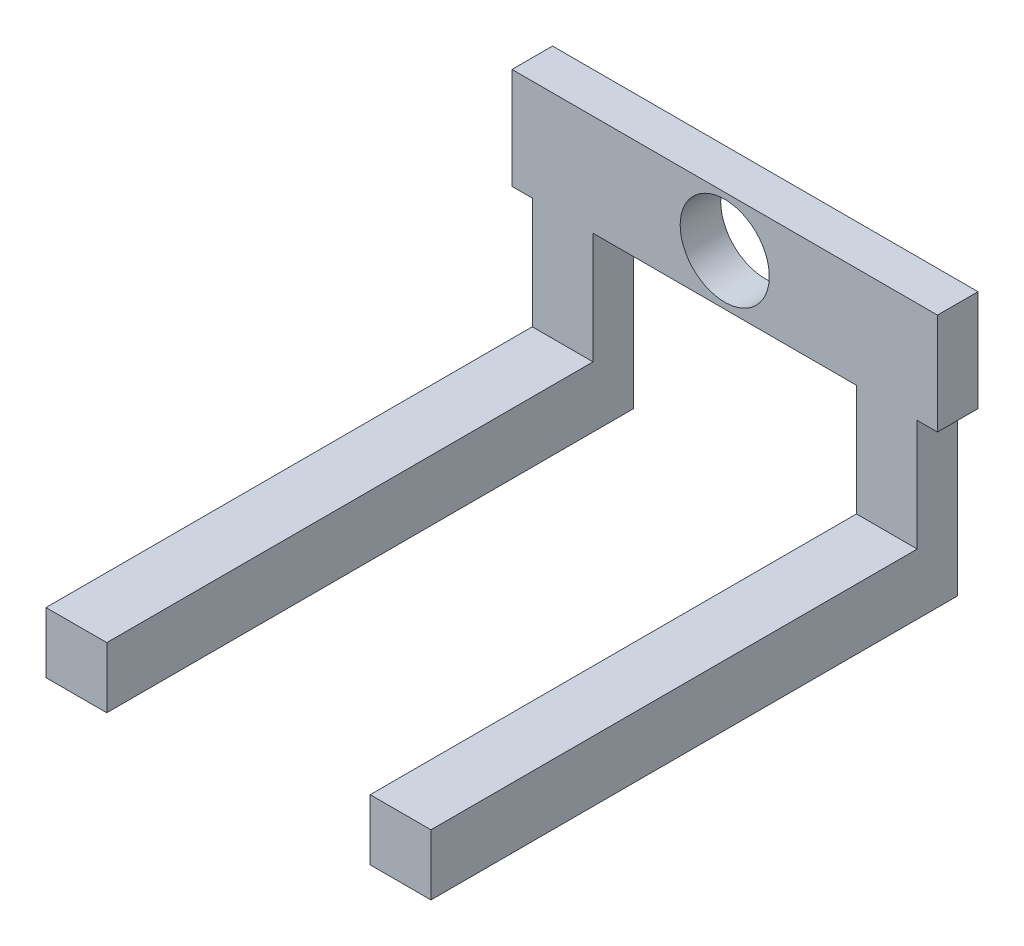
ISO-10303-21;
HEADER;
FILE_DESCRIPTION(('STEP AP214'),'2;1');
FILE_NAME('part.step','',(''),(''),'','','');
FILE_SCHEMA(('AUTOMOTIVE_DESIGN { 1 0 10303 214 1 1 1 1 }'));
ENDSEC;
DATA;
#1=APPLICATION_CONTEXT('core data for automotive mechanical design processes');
#2=APPLICATION_PROTOCOL_DEFINITION('international standard','automotive_design',2000,#1);
#3=PRODUCT_CONTEXT('',#1,'mechanical');
#4=PRODUCT('Part','Part','',(#3));
#5=PRODUCT_RELATED_PRODUCT_CATEGORY('part','',(#4));
#6=PRODUCT_DEFINITION_FORMATION('','',#4);
#7=PRODUCT_DEFINITION_CONTEXT('part definition',#1,'design');
#8=PRODUCT_DEFINITION('design','',#6,#7);
#9=PRODUCT_DEFINITION_SHAPE('','',#8);
#10=(LENGTH_UNIT() NAMED_UNIT(*) SI_UNIT(.MILLI.,.METRE.));
#11=(NAMED_UNIT(*) PLANE_ANGLE_UNIT() SI_UNIT($,.RADIAN.));
#12=(NAMED_UNIT(*) SI_UNIT($,.STERADIAN.) SOLID_ANGLE_UNIT());
#13=UNCERTAINTY_MEASURE_WITH_UNIT(LENGTH_MEASURE(1.E-05),#10,'distance_accuracy_value','');
#14=(GEOMETRIC_REPRESENTATION_CONTEXT(3) GLOBAL_UNCERTAINTY_ASSIGNED_CONTEXT((#13)) GLOBAL_UNIT_ASSIGNED_CONTEXT((#10,
#11,#12)) REPRESENTATION_CONTEXT('',''));
#15=CARTESIAN_POINT('',(0.,0.,0.));
#16=DIRECTION('',(0.,0.,1.));
#17=DIRECTION('',(1.,0.,0.));
#18=AXIS2_PLACEMENT_3D('',#15,#16,#17);
#19=CARTESIAN_POINT('',(0.,15.,125.));
#20=DIRECTION('',(0.,-1.,0.));
#21=DIRECTION('',(0.,0.,-1.));
#22=AXIS2_PLACEMENT_3D('',#19,#20,#21);
#23=PLANE('',#22);
#24=DIRECTION('',(1.,0.,0.));
#25=VECTOR('',#24,1.);
#26=CARTESIAN_POINT('',(0.,15.,5.));
#27=LINE('',#26,#25);
#28=CARTESIAN_POINT('',(0.,15.,5.));
#29=VERTEX_POINT('',#28);
#30=CARTESIAN_POINT('',(15.,15.,5.));
#31=VERTEX_POINT('',#30);
#32=EDGE_CURVE('E11',#29,#31,#27,.T.);
#33=ORIENTED_EDGE('',*,*,#32,.F.);
#34=DIRECTION('',(0.,0.,-1.));
#35=VECTOR('',#34,1.);
#36=CARTESIAN_POINT('',(0.,15.,125.));
#37=LINE('',#36,#35);
#38=CARTESIAN_POINT('',(0.,15.,125.));
#39=VERTEX_POINT('',#38);
#40=EDGE_CURVE('E318',#39,#29,#37,.T.);
#41=ORIENTED_EDGE('',*,*,#40,.F.);
#42=DIRECTION('',(-1.,0.,0.));
#43=VECTOR('',#42,1.);
#44=CARTESIAN_POINT('',(0.,15.,125.));
#45=LINE('',#44,#43);
#46=CARTESIAN_POINT('',(15.,15.,125.));
#47=VERTEX_POINT('',#46);
#48=EDGE_CURVE('E57',#47,#39,#45,.T.);
#49=ORIENTED_EDGE('',*,*,#48,.F.);
#50=DIRECTION('',(0.,0.,-1.));
#51=VECTOR('',#50,1.);
#52=CARTESIAN_POINT('',(15.,15.,125.));
#53=LINE('',#52,#51);
#54=EDGE_CURVE('E322',#47,#31,#53,.T.);
#55=ORIENTED_EDGE('',*,*,#54,.T.);
#56=EDGE_LOOP('',(#33,#41,#49,#55));
#57=FACE_BOUND('',#56,.T.);
#58=ADVANCED_FACE('F41',(#57),#23,.F.);
#59=CARTESIAN_POINT('',(0.,0.,125.));
#60=DIRECTION('',(1.,0.,0.));
#61=DIRECTION('',(0.,0.,-1.));
#62=AXIS2_PLACEMENT_3D('',#59,#60,#61);
#63=PLANE('',#62);
#64=DIRECTION('',(0.,1.,0.));
#65=VECTOR('',#64,1.);
#66=CARTESIAN_POINT('',(0.,0.,-5.));
#67=LINE('',#66,#65);
#68=CARTESIAN_POINT('',(0.,0.,-5.));
#69=VERTEX_POINT('',#68);
#70=CARTESIAN_POINT('',(0.,42.5,-5.));
#71=VERTEX_POINT('',#70);
#72=EDGE_CURVE('E177',#69,#71,#67,.T.);
#73=ORIENTED_EDGE('',*,*,#72,.F.);
#74=DIRECTION('',(0.,0.,-1.));
#75=VECTOR('',#74,1.);
#76=CARTESIAN_POINT('',(0.,0.,125.));
#77=LINE('',#76,#75);
#78=CARTESIAN_POINT('',(0.,0.,125.));
#79=VERTEX_POINT('',#78);
#80=EDGE_CURVE('E50',#79,#69,#77,.T.);
#81=ORIENTED_EDGE('',*,*,#80,.F.);
#82=DIRECTION('',(0.,-1.,0.));
#83=VECTOR('',#82,1.);
#84=CARTESIAN_POINT('',(0.,0.,125.));
#85=LINE('',#84,#83);
#86=EDGE_CURVE('E288',#39,#79,#85,.T.);
#87=ORIENTED_EDGE('',*,*,#86,.F.);
#88=ORIENTED_EDGE('',*,*,#40,.T.);
#89=DIRECTION('',(0.,1.,0.));
#90=VECTOR('',#89,1.);
#91=CARTESIAN_POINT('',(0.,0.,5.));
#92=LINE('',#91,#90);
#93=CARTESIAN_POINT('',(0.,42.5,5.));
#94=VERTEX_POINT('',#93);
#95=EDGE_CURVE('E214',#29,#94,#92,.T.);
#96=ORIENTED_EDGE('',*,*,#95,.T.);
#97=DIRECTION('',(0.,0.,-1.));
#98=VECTOR('',#97,1.);
#99=CARTESIAN_POINT('',(0.,42.5,5.));
#100=LINE('',#99,#98);
#101=EDGE_CURVE('E253',#94,#71,#100,.T.);
#102=ORIENTED_EDGE('',*,*,#101,.T.);
#103=EDGE_LOOP('',(#73,#81,#87,#88,#96,#102));
#104=FACE_BOUND('',#103,.T.);
#105=ADVANCED_FACE('F43',(#104),#63,.F.);
#106=CARTESIAN_POINT('',(0.,0.,125.));
#107=DIRECTION('',(0.,1.,0.));
#108=DIRECTION('',(0.,0.,1.));
#109=AXIS2_PLACEMENT_3D('',#106,#107,#108);
#110=PLANE('',#109);
#111=DIRECTION('',(-1.,0.,0.));
#112=VECTOR('',#111,1.);
#113=CARTESIAN_POINT('',(0.,0.,-5.));
#114=LINE('',#113,#112);
#115=CARTESIAN_POINT('',(15.,0.,-5.));
#116=VERTEX_POINT('',#115);
#117=EDGE_CURVE('E218',#116,#69,#114,.T.);
#118=ORIENTED_EDGE('',*,*,#117,.F.);
#119=DIRECTION('',(0.,0.,-1.));
#120=VECTOR('',#119,1.);
#121=CARTESIAN_POINT('',(15.,0.,125.));
#122=LINE('',#121,#120);
#123=CARTESIAN_POINT('',(15.,0.,125.));
#124=VERTEX_POINT('',#123);
#125=EDGE_CURVE('E326',#124,#116,#122,.T.);
#126=ORIENTED_EDGE('',*,*,#125,.F.);
#127=DIRECTION('',(1.,0.,0.));
#128=VECTOR('',#127,1.);
#129=CARTESIAN_POINT('',(0.,0.,125.));
#130=LINE('',#129,#128);
#131=EDGE_CURVE('E311',#79,#124,#130,.T.);
#132=ORIENTED_EDGE('',*,*,#131,.F.);
#133=ORIENTED_EDGE('',*,*,#80,.T.);
#134=EDGE_LOOP('',(#118,#126,#132,#133));
#135=FACE_BOUND('',#134,.T.);
#136=ADVANCED_FACE('F333',(#135),#110,.F.);
#137=CARTESIAN_POINT('',(15.,0.,125.));
#138=DIRECTION('',(-1.,0.,0.));
#139=DIRECTION('',(0.,0.,1.));
#140=AXIS2_PLACEMENT_3D('',#137,#138,#139);
#141=PLANE('',#140);
#142=DIRECTION('',(0.,1.,0.));
#143=VECTOR('',#142,1.);
#144=CARTESIAN_POINT('',(15.,0.,5.));
#145=LINE('',#144,#143);
#146=CARTESIAN_POINT('',(15.,42.5,5.));
#147=VERTEX_POINT('',#146);
#148=EDGE_CURVE('E250',#31,#147,#145,.T.);
#149=ORIENTED_EDGE('',*,*,#148,.F.);
#150=ORIENTED_EDGE('',*,*,#54,.F.);
#151=DIRECTION('',(0.,1.,0.));
#152=VECTOR('',#151,1.);
#153=CARTESIAN_POINT('',(15.,0.,125.));
#154=LINE('',#153,#152);
#155=EDGE_CURVE('E62',#124,#47,#154,.T.);
#156=ORIENTED_EDGE('',*,*,#155,.F.);
#157=ORIENTED_EDGE('',*,*,#125,.T.);
#158=DIRECTION('',(0.,1.,0.));
#159=VECTOR('',#158,1.);
#160=CARTESIAN_POINT('',(15.,0.,-5.));
#161=LINE('',#160,#159);
#162=CARTESIAN_POINT('',(15.,42.5,-5.));
#163=VERTEX_POINT('',#162);
#164=EDGE_CURVE('E278',#116,#163,#161,.T.);
#165=ORIENTED_EDGE('',*,*,#164,.T.);
#166=DIRECTION('',(0.,0.,-1.));
#167=VECTOR('',#166,1.);
#168=CARTESIAN_POINT('',(15.,42.5,5.));
#169=LINE('',#168,#167);
#170=EDGE_CURVE('E285',#147,#163,#169,.T.);
#171=ORIENTED_EDGE('',*,*,#170,.F.);
#172=EDGE_LOOP('',(#149,#150,#156,#157,#165,#171));
#173=FACE_BOUND('',#172,.T.);
#174=ADVANCED_FACE('F343',(#173),#141,.F.);
#175=CARTESIAN_POINT('',(0.,0.,125.));
#176=DIRECTION('',(0.,0.,-1.));
#177=DIRECTION('',(-1.,0.,0.));
#178=AXIS2_PLACEMENT_3D('',#175,#176,#177);
#179=PLANE('',#178);
#180=ORIENTED_EDGE('',*,*,#86,.T.);
#181=ORIENTED_EDGE('',*,*,#131,.T.);
#182=ORIENTED_EDGE('',*,*,#155,.T.);
#183=ORIENTED_EDGE('',*,*,#48,.T.);
#184=EDGE_LOOP('',(#180,#181,#182,#183));
#185=FACE_BOUND('',#184,.T.);
#186=ADVANCED_FACE('F346',(#185),#179,.F.);
#187=CARTESIAN_POINT('',(0.,0.,5.));
#188=DIRECTION('',(0.,0.,-1.));
#189=DIRECTION('',(-1.,0.,0.));
#190=AXIS2_PLACEMENT_3D('',#187,#188,#189);
#191=PLANE('',#190);
#192=CARTESIAN_POINT('',(47.5,55.,5.));
#193=DIRECTION('',(0.,0.,-1.));
#194=DIRECTION('',(-1.,0.,0.));
#195=AXIS2_PLACEMENT_3D('',#192,#193,#194);
#196=CIRCLE('',#195,11.);
#197=CARTESIAN_POINT('',(36.5,55.,5.));
#198=VERTEX_POINT('',#197);
#199=EDGE_CURVE('E187',#198,#198,#196,.T.);
#200=ORIENTED_EDGE('',*,*,#199,.T.);
#201=EDGE_LOOP('',(#200));
#202=FACE_BOUND('',#201,.T.);
#203=ORIENTED_EDGE('',*,*,#95,.F.);
#204=ORIENTED_EDGE('',*,*,#32,.T.);
#205=ORIENTED_EDGE('',*,*,#148,.T.);
#206=DIRECTION('',(-1.,0.,0.));
#207=VECTOR('',#206,1.);
#208=CARTESIAN_POINT('',(0.,42.5,5.));
#209=LINE('',#208,#207);
#210=CARTESIAN_POINT('',(80.,42.5,5.));
#211=VERTEX_POINT('',#210);
#212=EDGE_CURVE('E246',#211,#147,#209,.T.);
#213=ORIENTED_EDGE('',*,*,#212,.F.);
#214=DIRECTION('',(0.,1.,0.));
#215=VECTOR('',#214,1.);
#216=CARTESIAN_POINT('',(80.,0.,5.));
#217=LINE('',#216,#215);
#218=CARTESIAN_POINT('',(80.,15.,5.));
#219=VERTEX_POINT('',#218);
#220=EDGE_CURVE('E243',#219,#211,#217,.T.);
#221=ORIENTED_EDGE('',*,*,#220,.F.);
#222=DIRECTION('',(1.,0.,0.));
#223=VECTOR('',#222,1.);
#224=CARTESIAN_POINT('',(0.,15.,5.));
#225=LINE('',#224,#223);
#226=CARTESIAN_POINT('',(95.,15.,5.));
#227=VERTEX_POINT('',#226);
#228=EDGE_CURVE('E239',#219,#227,#225,.T.);
#229=ORIENTED_EDGE('',*,*,#228,.T.);
#230=DIRECTION('',(0.,1.,0.));
#231=VECTOR('',#230,1.);
#232=CARTESIAN_POINT('',(95.,0.,5.));
#233=LINE('',#232,#231);
#234=CARTESIAN_POINT('',(95.,42.5,5.));
#235=VERTEX_POINT('',#234);
#236=EDGE_CURVE('E236',#227,#235,#233,.T.);
#237=ORIENTED_EDGE('',*,*,#236,.T.);
#238=DIRECTION('',(-1.,0.,0.));
#239=VECTOR('',#238,1.);
#240=CARTESIAN_POINT('',(0.,42.5,5.));
#241=LINE('',#240,#239);
#242=CARTESIAN_POINT('',(100.,42.5,5.));
#243=VERTEX_POINT('',#242);
#244=EDGE_CURVE('E232',#243,#235,#241,.T.);
#245=ORIENTED_EDGE('',*,*,#244,.F.);
#246=DIRECTION('',(0.,-1.,0.));
#247=VECTOR('',#246,1.);
#248=CARTESIAN_POINT('',(100.,0.,5.));
#249=LINE('',#248,#247);
#250=CARTESIAN_POINT('',(100.,67.5,5.));
#251=VERTEX_POINT('',#250);
#252=EDGE_CURVE('E228',#251,#243,#249,.T.);
#253=ORIENTED_EDGE('',*,*,#252,.F.);
#254=DIRECTION('',(-1.,0.,0.));
#255=VECTOR('',#254,1.);
#256=CARTESIAN_POINT('',(0.,67.5,5.));
#257=LINE('',#256,#255);
#258=CARTESIAN_POINT('',(-5.,67.5,5.));
#259=VERTEX_POINT('',#258);
#260=EDGE_CURVE('E225',#251,#259,#257,.T.);
#261=ORIENTED_EDGE('',*,*,#260,.T.);
#262=DIRECTION('',(0.,-1.,0.));
#263=VECTOR('',#262,1.);
#264=CARTESIAN_POINT('',(-5.,0.,5.));
#265=LINE('',#264,#263);
#266=CARTESIAN_POINT('',(-5.,42.5,5.));
#267=VERTEX_POINT('',#266);
#268=EDGE_CURVE('E222',#259,#267,#265,.T.);
#269=ORIENTED_EDGE('',*,*,#268,.T.);
#270=DIRECTION('',(-1.,0.,0.));
#271=VECTOR('',#270,1.);
#272=CARTESIAN_POINT('',(0.,42.5,5.));
#273=LINE('',#272,#271);
#274=EDGE_CURVE('E217',#94,#267,#273,.T.);
#275=ORIENTED_EDGE('',*,*,#274,.F.);
#276=EDGE_LOOP('',(#203,#204,#205,#213,#221,#229,#237,#245,#253,#261,#269,#275));
#277=FACE_BOUND('',#276,.T.);
#278=ADVANCED_FACE('F348',(#202,#277),#191,.F.);
#279=CARTESIAN_POINT('',(0.,42.5,5.));
#280=DIRECTION('',(0.,-1.,0.));
#281=DIRECTION('',(0.,0.,-1.));
#282=AXIS2_PLACEMENT_3D('',#279,#280,#281);
#283=PLANE('',#282);
#284=DIRECTION('',(-1.,0.,0.));
#285=VECTOR('',#284,1.);
#286=CARTESIAN_POINT('',(0.,42.5,-5.));
#287=LINE('',#286,#285);
#288=CARTESIAN_POINT('',(80.,42.5,-5.));
#289=VERTEX_POINT('',#288);
#290=EDGE_CURVE('E166',#289,#163,#287,.T.);
#291=ORIENTED_EDGE('',*,*,#290,.F.);
#292=DIRECTION('',(0.,0.,-1.));
#293=VECTOR('',#292,1.);
#294=CARTESIAN_POINT('',(80.,42.5,5.));
#295=LINE('',#294,#293);
#296=EDGE_CURVE('E160',#211,#289,#295,.T.);
#297=ORIENTED_EDGE('',*,*,#296,.F.);
#298=ORIENTED_EDGE('',*,*,#212,.T.);
#299=ORIENTED_EDGE('',*,*,#170,.T.);
#300=EDGE_LOOP('',(#291,#297,#298,#299));
#301=FACE_BOUND('',#300,.T.);
#302=ADVANCED_FACE('F354',(#301),#283,.T.);
#303=CARTESIAN_POINT('',(80.,0.,5.));
#304=DIRECTION('',(-1.,0.,0.));
#305=DIRECTION('',(0.,0.,1.));
#306=AXIS2_PLACEMENT_3D('',#303,#304,#305);
#307=PLANE('',#306);
#308=DIRECTION('',(0.,1.,0.));
#309=VECTOR('',#308,1.);
#310=CARTESIAN_POINT('',(80.,0.,-5.));
#311=LINE('',#310,#309);
#312=CARTESIAN_POINT('',(80.,0.,-5.));
#313=VERTEX_POINT('',#312);
#314=EDGE_CURVE('E154',#313,#289,#311,.T.);
#315=ORIENTED_EDGE('',*,*,#314,.F.);
#316=DIRECTION('',(0.,0.,-1.));
#317=VECTOR('',#316,1.);
#318=CARTESIAN_POINT('',(80.,0.,125.));
#319=LINE('',#318,#317);
#320=CARTESIAN_POINT('',(80.,0.,125.));
#321=VERTEX_POINT('',#320);
#322=EDGE_CURVE('E158',#321,#313,#319,.T.);
#323=ORIENTED_EDGE('',*,*,#322,.F.);
#324=DIRECTION('',(0.,-1.,0.));
#325=VECTOR('',#324,1.);
#326=CARTESIAN_POINT('',(80.,0.,125.));
#327=LINE('',#326,#325);
#328=CARTESIAN_POINT('',(80.,15.,125.));
#329=VERTEX_POINT('',#328);
#330=EDGE_CURVE('E186',#329,#321,#327,.T.);
#331=ORIENTED_EDGE('',*,*,#330,.F.);
#332=DIRECTION('',(0.,0.,-1.));
#333=VECTOR('',#332,1.);
#334=CARTESIAN_POINT('',(80.,15.,125.));
#335=LINE('',#334,#333);
#336=EDGE_CURVE('E205',#329,#219,#335,.T.);
#337=ORIENTED_EDGE('',*,*,#336,.T.);
#338=ORIENTED_EDGE('',*,*,#220,.T.);
#339=ORIENTED_EDGE('',*,*,#296,.T.);
#340=EDGE_LOOP('',(#315,#323,#331,#337,#338,#339));
#341=FACE_BOUND('',#340,.T.);
#342=ADVANCED_FACE('F156',(#341),#307,.T.);
#343=CARTESIAN_POINT('',(95.,0.,5.));
#344=DIRECTION('',(-1.,0.,0.));
#345=DIRECTION('',(0.,0.,1.));
#346=AXIS2_PLACEMENT_3D('',#343,#344,#345);
#347=PLANE('',#346);
#348=DIRECTION('',(0.,0.,-1.));
#349=VECTOR('',#348,1.);
#350=CARTESIAN_POINT('',(95.,0.,125.));
#351=LINE('',#350,#349);
#352=CARTESIAN_POINT('',(95.,0.,125.));
#353=VERTEX_POINT('',#352);
#354=CARTESIAN_POINT('',(95.,0.,-5.));
#355=VERTEX_POINT('',#354);
#356=EDGE_CURVE('E178',#353,#355,#351,.T.);
#357=ORIENTED_EDGE('',*,*,#356,.T.);
#358=DIRECTION('',(0.,1.,0.));
#359=VECTOR('',#358,1.);
#360=CARTESIAN_POINT('',(95.,0.,-5.));
#361=LINE('',#360,#359);
#362=CARTESIAN_POINT('',(95.,42.5,-5.));
#363=VERTEX_POINT('',#362);
#364=EDGE_CURVE('E167',#355,#363,#361,.T.);
#365=ORIENTED_EDGE('',*,*,#364,.T.);
#366=DIRECTION('',(0.,0.,-1.));
#367=VECTOR('',#366,1.);
#368=CARTESIAN_POINT('',(95.,42.5,5.));
#369=LINE('',#368,#367);
#370=EDGE_CURVE('E291',#235,#363,#369,.T.);
#371=ORIENTED_EDGE('',*,*,#370,.F.);
#372=ORIENTED_EDGE('',*,*,#236,.F.);
#373=DIRECTION('',(0.,0.,-1.));
#374=VECTOR('',#373,1.);
#375=CARTESIAN_POINT('',(95.,15.,125.));
#376=LINE('',#375,#374);
#377=CARTESIAN_POINT('',(95.,15.,125.));
#378=VERTEX_POINT('',#377);
#379=EDGE_CURVE('E209',#378,#227,#376,.T.);
#380=ORIENTED_EDGE('',*,*,#379,.F.);
#381=DIRECTION('',(0.,1.,0.));
#382=VECTOR('',#381,1.);
#383=CARTESIAN_POINT('',(95.,0.,125.));
#384=LINE('',#383,#382);
#385=EDGE_CURVE('E199',#353,#378,#384,.T.);
#386=ORIENTED_EDGE('',*,*,#385,.F.);
#387=EDGE_LOOP('',(#357,#365,#371,#372,#380,#386));
#388=FACE_BOUND('',#387,.T.);
#389=ADVANCED_FACE('F397',(#388),#347,.F.);
#390=CARTESIAN_POINT('',(0.,42.5,5.));
#391=DIRECTION('',(0.,-1.,0.));
#392=DIRECTION('',(0.,0.,-1.));
#393=AXIS2_PLACEMENT_3D('',#390,#391,#392);
#394=PLANE('',#393);
#395=DIRECTION('',(-1.,0.,0.));
#396=VECTOR('',#395,1.);
#397=CARTESIAN_POINT('',(0.,42.5,-5.));
#398=LINE('',#397,#396);
#399=CARTESIAN_POINT('',(100.,42.5,-5.));
#400=VERTEX_POINT('',#399);
#401=EDGE_CURVE('E271',#400,#363,#398,.T.);
#402=ORIENTED_EDGE('',*,*,#401,.F.);
#403=DIRECTION('',(0.,0.,-1.));
#404=VECTOR('',#403,1.);
#405=CARTESIAN_POINT('',(100.,42.5,5.));
#406=LINE('',#405,#404);
#407=EDGE_CURVE('E294',#243,#400,#406,.T.);
#408=ORIENTED_EDGE('',*,*,#407,.F.);
#409=ORIENTED_EDGE('',*,*,#244,.T.);
#410=ORIENTED_EDGE('',*,*,#370,.T.);
#411=EDGE_LOOP('',(#402,#408,#409,#410));
#412=FACE_BOUND('',#411,.T.);
#413=ADVANCED_FACE('F391',(#412),#394,.T.);
#414=CARTESIAN_POINT('',(100.,0.,5.));
#415=DIRECTION('',(1.,0.,0.));
#416=DIRECTION('',(0.,0.,-1.));
#417=AXIS2_PLACEMENT_3D('',#414,#415,#416);
#418=PLANE('',#417);
#419=DIRECTION('',(0.,-1.,0.));
#420=VECTOR('',#419,1.);
#421=CARTESIAN_POINT('',(100.,0.,-5.));
#422=LINE('',#421,#420);
#423=CARTESIAN_POINT('',(100.,67.5,-5.));
#424=VERTEX_POINT('',#423);
#425=EDGE_CURVE('E267',#424,#400,#422,.T.);
#426=ORIENTED_EDGE('',*,*,#425,.F.);
#427=DIRECTION('',(0.,0.,-1.));
#428=VECTOR('',#427,1.);
#429=CARTESIAN_POINT('',(100.,67.5,5.));
#430=LINE('',#429,#428);
#431=EDGE_CURVE('E297',#251,#424,#430,.T.);
#432=ORIENTED_EDGE('',*,*,#431,.F.);
#433=ORIENTED_EDGE('',*,*,#252,.T.);
#434=ORIENTED_EDGE('',*,*,#407,.T.);
#435=EDGE_LOOP('',(#426,#432,#433,#434));
#436=FACE_BOUND('',#435,.T.);
#437=ADVANCED_FACE('F396',(#436),#418,.T.);
#438=CARTESIAN_POINT('',(0.,67.5,5.));
#439=DIRECTION('',(0.,-1.,0.));
#440=DIRECTION('',(0.,0.,-1.));
#441=AXIS2_PLACEMENT_3D('',#438,#439,#440);
#442=PLANE('',#441);
#443=DIRECTION('',(-1.,0.,0.));
#444=VECTOR('',#443,1.);
#445=CARTESIAN_POINT('',(0.,67.5,-5.));
#446=LINE('',#445,#444);
#447=CARTESIAN_POINT('',(-5.,67.5,-5.));
#448=VERTEX_POINT('',#447);
#449=EDGE_CURVE('E264',#424,#448,#446,.T.);
#450=ORIENTED_EDGE('',*,*,#449,.T.);
#451=DIRECTION('',(0.,0.,-1.));
#452=VECTOR('',#451,1.);
#453=CARTESIAN_POINT('',(-5.,67.5,5.));
#454=LINE('',#453,#452);
#455=EDGE_CURVE('E300',#259,#448,#454,.T.);
#456=ORIENTED_EDGE('',*,*,#455,.F.);
#457=ORIENTED_EDGE('',*,*,#260,.F.);
#458=ORIENTED_EDGE('',*,*,#431,.T.);
#459=EDGE_LOOP('',(#450,#456,#457,#458));
#460=FACE_BOUND('',#459,.T.);
#461=ADVANCED_FACE('F409',(#460),#442,.F.);
#462=CARTESIAN_POINT('',(-5.,0.,5.));
#463=DIRECTION('',(1.,0.,0.));
#464=DIRECTION('',(0.,0.,-1.));
#465=AXIS2_PLACEMENT_3D('',#462,#463,#464);
#466=PLANE('',#465);
#467=DIRECTION('',(0.,-1.,0.));
#468=VECTOR('',#467,1.);
#469=CARTESIAN_POINT('',(-5.,0.,-5.));
#470=LINE('',#469,#468);
#471=CARTESIAN_POINT('',(-5.,42.5,-5.));
#472=VERTEX_POINT('',#471);
#473=EDGE_CURVE('E260',#448,#472,#470,.T.);
#474=ORIENTED_EDGE('',*,*,#473,.T.);
#475=DIRECTION('',(0.,0.,-1.));
#476=VECTOR('',#475,1.);
#477=CARTESIAN_POINT('',(-5.,42.5,5.));
#478=LINE('',#477,#476);
#479=EDGE_CURVE('E304',#267,#472,#478,.T.);
#480=ORIENTED_EDGE('',*,*,#479,.F.);
#481=ORIENTED_EDGE('',*,*,#268,.F.);
#482=ORIENTED_EDGE('',*,*,#455,.T.);
#483=EDGE_LOOP('',(#474,#480,#481,#482));
#484=FACE_BOUND('',#483,.T.);
#485=ADVANCED_FACE('F420',(#484),#466,.F.);
#486=CARTESIAN_POINT('',(0.,42.5,5.));
#487=DIRECTION('',(0.,-1.,0.));
#488=DIRECTION('',(0.,0.,-1.));
#489=AXIS2_PLACEMENT_3D('',#486,#487,#488);
#490=PLANE('',#489);
#491=DIRECTION('',(-1.,0.,0.));
#492=VECTOR('',#491,1.);
#493=CARTESIAN_POINT('',(0.,42.5,-5.));
#494=LINE('',#493,#492);
#495=EDGE_CURVE('E256',#71,#472,#494,.T.);
#496=ORIENTED_EDGE('',*,*,#495,.F.);
#497=ORIENTED_EDGE('',*,*,#101,.F.);
#498=ORIENTED_EDGE('',*,*,#274,.T.);
#499=ORIENTED_EDGE('',*,*,#479,.T.);
#500=EDGE_LOOP('',(#496,#497,#498,#499));
#501=FACE_BOUND('',#500,.T.);
#502=ADVANCED_FACE('F431',(#501),#490,.T.);
#503=CARTESIAN_POINT('',(0.,0.,-5.));
#504=DIRECTION('',(0.,0.,-1.));
#505=DIRECTION('',(-1.,0.,0.));
#506=AXIS2_PLACEMENT_3D('',#503,#504,#505);
#507=PLANE('',#506);
#508=CARTESIAN_POINT('',(47.5,55.,-5.));
#509=DIRECTION('',(0.,0.,-1.));
#510=DIRECTION('',(-1.,0.,0.));
#511=AXIS2_PLACEMENT_3D('',#508,#509,#510);
#512=CIRCLE('',#511,11.);
#513=CARTESIAN_POINT('',(36.5,55.,-5.));
#514=VERTEX_POINT('',#513);
#515=EDGE_CURVE('E193',#514,#514,#512,.T.);
#516=ORIENTED_EDGE('',*,*,#515,.F.);
#517=EDGE_LOOP('',(#516));
#518=FACE_BOUND('',#517,.T.);
#519=ORIENTED_EDGE('',*,*,#72,.T.);
#520=ORIENTED_EDGE('',*,*,#495,.T.);
#521=ORIENTED_EDGE('',*,*,#473,.F.);
#522=ORIENTED_EDGE('',*,*,#449,.F.);
#523=ORIENTED_EDGE('',*,*,#425,.T.);
#524=ORIENTED_EDGE('',*,*,#401,.T.);
#525=ORIENTED_EDGE('',*,*,#364,.F.);
#526=DIRECTION('',(-1.,0.,0.));
#527=VECTOR('',#526,1.);
#528=CARTESIAN_POINT('',(95.,0.,-5.));
#529=LINE('',#528,#527);
#530=EDGE_CURVE('E173',#355,#313,#529,.T.);
#531=ORIENTED_EDGE('',*,*,#530,.T.);
#532=ORIENTED_EDGE('',*,*,#314,.T.);
#533=ORIENTED_EDGE('',*,*,#290,.T.);
#534=ORIENTED_EDGE('',*,*,#164,.F.);
#535=ORIENTED_EDGE('',*,*,#117,.T.);
#536=EDGE_LOOP('',(#519,#520,#521,#522,#523,#524,#525,#531,#532,#533,#534,#535));
#537=FACE_BOUND('',#536,.T.);
#538=ADVANCED_FACE('F181',(#518,#537),#507,.T.);
#539=CARTESIAN_POINT('',(80.,15.,125.));
#540=DIRECTION('',(0.,-1.,0.));
#541=DIRECTION('',(0.,0.,-1.));
#542=AXIS2_PLACEMENT_3D('',#539,#540,#541);
#543=PLANE('',#542);
#544=ORIENTED_EDGE('',*,*,#379,.T.);
#545=ORIENTED_EDGE('',*,*,#228,.F.);
#546=ORIENTED_EDGE('',*,*,#336,.F.);
#547=DIRECTION('',(-1.,0.,0.));
#548=VECTOR('',#547,1.);
#549=CARTESIAN_POINT('',(80.,15.,125.));
#550=LINE('',#549,#548);
#551=EDGE_CURVE('E202',#378,#329,#550,.T.);
#552=ORIENTED_EDGE('',*,*,#551,.F.);
#553=EDGE_LOOP('',(#544,#545,#546,#552));
#554=FACE_BOUND('',#553,.T.);
#555=ADVANCED_FACE('F447',(#554),#543,.F.);
#556=CARTESIAN_POINT('',(80.,0.,125.));
#557=DIRECTION('',(0.,1.,0.));
#558=DIRECTION('',(0.,0.,1.));
#559=AXIS2_PLACEMENT_3D('',#556,#557,#558);
#560=PLANE('',#559);
#561=ORIENTED_EDGE('',*,*,#322,.T.);
#562=ORIENTED_EDGE('',*,*,#530,.F.);
#563=ORIENTED_EDGE('',*,*,#356,.F.);
#564=DIRECTION('',(1.,0.,0.));
#565=VECTOR('',#564,1.);
#566=CARTESIAN_POINT('',(80.,0.,125.));
#567=LINE('',#566,#565);
#568=EDGE_CURVE('E174',#321,#353,#567,.T.);
#569=ORIENTED_EDGE('',*,*,#568,.F.);
#570=EDGE_LOOP('',(#561,#562,#563,#569));
#571=FACE_BOUND('',#570,.T.);
#572=ADVANCED_FACE('F171',(#571),#560,.F.);
#573=CARTESIAN_POINT('',(0.,0.,125.));
#574=DIRECTION('',(0.,0.,-1.));
#575=DIRECTION('',(-1.,0.,0.));
#576=AXIS2_PLACEMENT_3D('',#573,#574,#575);
#577=PLANE('',#576);
#578=ORIENTED_EDGE('',*,*,#330,.T.);
#579=ORIENTED_EDGE('',*,*,#568,.T.);
#580=ORIENTED_EDGE('',*,*,#385,.T.);
#581=ORIENTED_EDGE('',*,*,#551,.T.);
#582=EDGE_LOOP('',(#578,#579,#580,#581));
#583=FACE_BOUND('',#582,.T.);
#584=ADVANCED_FACE('F460',(#583),#577,.F.);
#585=CARTESIAN_POINT('',(47.5,55.,48.));
#586=DIRECTION('',(0.,0.,-1.));
#587=DIRECTION('',(-1.,0.,0.));
#588=AXIS2_PLACEMENT_3D('',#585,#586,#587);
#589=CYLINDRICAL_SURFACE('',#588,11.);
#590=ORIENTED_EDGE('',*,*,#515,.T.);
#591=EDGE_LOOP('',(#590));
#592=FACE_BOUND('',#591,.T.);
#593=ORIENTED_EDGE('',*,*,#199,.F.);
#594=EDGE_LOOP('',(#593));
#595=FACE_BOUND('',#594,.T.);
#596=ADVANCED_FACE('F465',(#592,#595),#589,.F.);
#597=CLOSED_SHELL('',(#58,#105,#136,#174,#186,#278,#302,#342,#389,#413,#437,#461,#485,#502,#538,
#555,#572,#584,#596));
#598=MANIFOLD_SOLID_BREP('B2',#597);
#599=ADVANCED_BREP_SHAPE_REPRESENTATION('',(#18,#598),#14);
#600=SHAPE_DEFINITION_REPRESENTATION(#9,#599);
ENDSEC;
END-ISO-10303-21;
